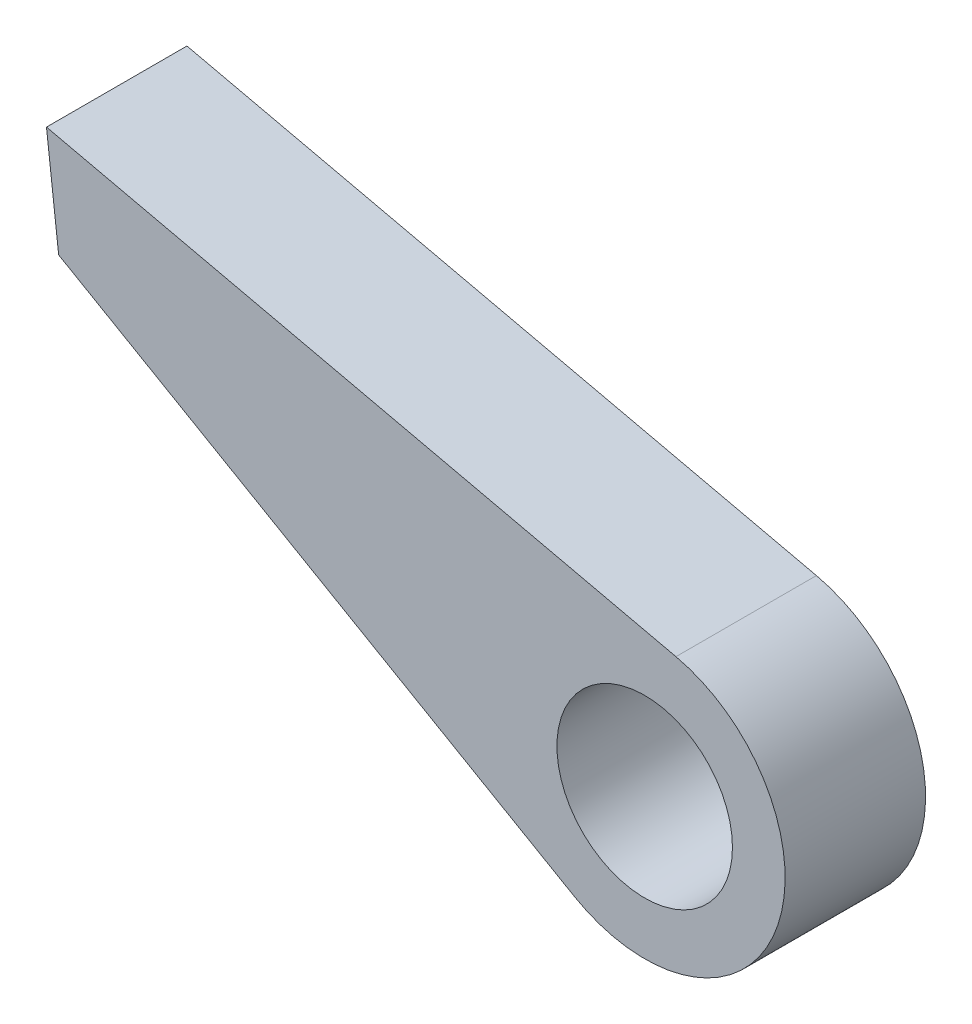
ISO-10303-21;
HEADER;
FILE_DESCRIPTION(('STEP AP214'),'2;1');
FILE_NAME('part.step','',(''),(''),'','','');
FILE_SCHEMA(('AUTOMOTIVE_DESIGN { 1 0 10303 214 1 1 1 1 }'));
ENDSEC;
DATA;
#1=APPLICATION_CONTEXT('core data for automotive mechanical design processes');
#2=APPLICATION_PROTOCOL_DEFINITION('international standard','automotive_design',2000,#1);
#3=PRODUCT_CONTEXT('',#1,'mechanical');
#4=PRODUCT('Part','Part','',(#3));
#5=PRODUCT_RELATED_PRODUCT_CATEGORY('part','',(#4));
#6=PRODUCT_DEFINITION_FORMATION('','',#4);
#7=PRODUCT_DEFINITION_CONTEXT('part definition',#1,'design');
#8=PRODUCT_DEFINITION('design','',#6,#7);
#9=PRODUCT_DEFINITION_SHAPE('','',#8);
#10=(LENGTH_UNIT() NAMED_UNIT(*) SI_UNIT(.MILLI.,.METRE.));
#11=(NAMED_UNIT(*) PLANE_ANGLE_UNIT() SI_UNIT($,.RADIAN.));
#12=(NAMED_UNIT(*) SI_UNIT($,.STERADIAN.) SOLID_ANGLE_UNIT());
#13=UNCERTAINTY_MEASURE_WITH_UNIT(LENGTH_MEASURE(1.E-05),#10,'distance_accuracy_value','');
#14=(GEOMETRIC_REPRESENTATION_CONTEXT(3) GLOBAL_UNCERTAINTY_ASSIGNED_CONTEXT((#13)) GLOBAL_UNIT_ASSIGNED_CONTEXT((#10,
#11,#12)) REPRESENTATION_CONTEXT('',''));
#15=CARTESIAN_POINT('',(0.,0.,0.));
#16=DIRECTION('',(0.,0.,1.));
#17=DIRECTION('',(1.,0.,0.));
#18=AXIS2_PLACEMENT_3D('',#15,#16,#17);
#19=CARTESIAN_POINT('',(0.,0.,2.));
#20=DIRECTION('',(0.,0.,1.));
#21=DIRECTION('',(1.,0.,0.));
#22=AXIS2_PLACEMENT_3D('',#19,#20,#21);
#23=PLANE('',#22);
#24=DIRECTION('',(0.115403848834899,-0.993318655655924,0.));
#25=VECTOR('',#24,1.);
#26=CARTESIAN_POINT('',(-8.34527668816388,2.50874666561476,2.));
#27=LINE('',#26,#25);
#28=CARTESIAN_POINT('',(-8.51838246141623,3.99872464909865,2.));
#29=VERTEX_POINT('',#28);
#30=CARTESIAN_POINT('',(-8.34527668816388,2.50874666561476,2.));
#31=VERTEX_POINT('',#30);
#32=EDGE_CURVE('E85',#29,#31,#27,.T.);
#33=ORIENTED_EDGE('',*,*,#32,.T.);
#34=DIRECTION('',(0.866025403784442,-0.499999999999995,0.));
#35=VECTOR('',#34,1.);
#36=CARTESIAN_POINT('',(-0.999999999999989,-1.73205080756888,2.));
#37=LINE('',#36,#35);
#38=CARTESIAN_POINT('',(-0.999999999999989,-1.73205080756888,2.));
#39=VERTEX_POINT('',#38);
#40=EDGE_CURVE('E80',#31,#39,#37,.T.);
#41=ORIENTED_EDGE('',*,*,#40,.T.);
#42=CARTESIAN_POINT('',(0.,0.,2.));
#43=DIRECTION('',(0.,0.,1.));
#44=DIRECTION('',(1.,0.,0.));
#45=AXIS2_PLACEMENT_3D('',#42,#43,#44);
#46=CIRCLE('',#45,2.);
#47=CARTESIAN_POINT('',(0.445667383964567,1.94971294883893,2.));
#48=VERTEX_POINT('',#47);
#49=EDGE_CURVE('E83',#39,#48,#46,.T.);
#50=ORIENTED_EDGE('',*,*,#49,.T.);
#51=DIRECTION('',(-0.974856474419463,0.222833691982284,0.));
#52=VECTOR('',#51,1.);
#53=CARTESIAN_POINT('',(-8.51838246141623,3.99872464909865,2.));
#54=LINE('',#53,#52);
#55=EDGE_CURVE('E50',#48,#29,#54,.T.);
#56=ORIENTED_EDGE('',*,*,#55,.T.);
#57=EDGE_LOOP('',(#33,#41,#50,#56));
#58=FACE_BOUND('',#57,.T.);
#59=CARTESIAN_POINT('',(0.,0.,2.));
#60=DIRECTION('',(0.,0.,1.));
#61=DIRECTION('',(1.,0.,0.));
#62=AXIS2_PLACEMENT_3D('',#59,#60,#61);
#63=CIRCLE('',#62,1.25);
#64=CARTESIAN_POINT('',(1.25,0.,2.));
#65=VERTEX_POINT('',#64);
#66=EDGE_CURVE('E100',#65,#65,#63,.T.);
#67=ORIENTED_EDGE('',*,*,#66,.F.);
#68=EDGE_LOOP('',(#67));
#69=FACE_BOUND('',#68,.T.);
#70=ADVANCED_FACE('F33',(#58,#69),#23,.T.);
#71=CARTESIAN_POINT('',(0.,0.,0.));
#72=DIRECTION('',(0.,0.,1.));
#73=DIRECTION('',(1.,0.,0.));
#74=AXIS2_PLACEMENT_3D('',#71,#72,#73);
#75=PLANE('',#74);
#76=DIRECTION('',(0.115403848834899,-0.993318655655924,0.));
#77=VECTOR('',#76,1.);
#78=CARTESIAN_POINT('',(-8.34527668816388,2.50874666561476,0.));
#79=LINE('',#78,#77);
#80=CARTESIAN_POINT('',(-8.51838246141623,3.99872464909865,0.));
#81=VERTEX_POINT('',#80);
#82=CARTESIAN_POINT('',(-8.34527668816388,2.50874666561476,0.));
#83=VERTEX_POINT('',#82);
#84=EDGE_CURVE('E97',#81,#83,#79,.T.);
#85=ORIENTED_EDGE('',*,*,#84,.F.);
#86=DIRECTION('',(-0.974856474419463,0.222833691982284,0.));
#87=VECTOR('',#86,1.);
#88=CARTESIAN_POINT('',(-8.51838246141623,3.99872464909865,0.));
#89=LINE('',#88,#87);
#90=CARTESIAN_POINT('',(0.445667383964567,1.94971294883893,0.));
#91=VERTEX_POINT('',#90);
#92=EDGE_CURVE('E73',#91,#81,#89,.T.);
#93=ORIENTED_EDGE('',*,*,#92,.F.);
#94=CARTESIAN_POINT('',(0.,0.,0.));
#95=DIRECTION('',(0.,0.,1.));
#96=DIRECTION('',(1.,0.,0.));
#97=AXIS2_PLACEMENT_3D('',#94,#95,#96);
#98=CIRCLE('',#97,2.);
#99=CARTESIAN_POINT('',(-0.999999999999989,-1.73205080756888,0.));
#100=VERTEX_POINT('',#99);
#101=EDGE_CURVE('E67',#100,#91,#98,.T.);
#102=ORIENTED_EDGE('',*,*,#101,.F.);
#103=DIRECTION('',(0.866025403784442,-0.499999999999995,0.));
#104=VECTOR('',#103,1.);
#105=CARTESIAN_POINT('',(-0.999999999999989,-1.73205080756888,0.));
#106=LINE('',#105,#104);
#107=EDGE_CURVE('E89',#83,#100,#106,.T.);
#108=ORIENTED_EDGE('',*,*,#107,.F.);
#109=EDGE_LOOP('',(#85,#93,#102,#108));
#110=FACE_BOUND('',#109,.T.);
#111=CARTESIAN_POINT('',(0.,0.,0.));
#112=DIRECTION('',(0.,0.,1.));
#113=DIRECTION('',(1.,0.,0.));
#114=AXIS2_PLACEMENT_3D('',#111,#112,#113);
#115=CIRCLE('',#114,1.25);
#116=CARTESIAN_POINT('',(1.25,0.,0.));
#117=VERTEX_POINT('',#116);
#118=EDGE_CURVE('E112',#117,#117,#115,.T.);
#119=ORIENTED_EDGE('',*,*,#118,.T.);
#120=EDGE_LOOP('',(#119));
#121=FACE_BOUND('',#120,.T.);
#122=ADVANCED_FACE('F108',(#110,#121),#75,.F.);
#123=CARTESIAN_POINT('',(-8.34527668816388,2.50874666561476,2.));
#124=DIRECTION('',(0.993318655655924,0.115403848834899,0.));
#125=DIRECTION('',(-0.115403848834899,0.993318655655924,0.));
#126=AXIS2_PLACEMENT_3D('',#123,#124,#125);
#127=PLANE('',#126);
#128=ORIENTED_EDGE('',*,*,#84,.T.);
#129=DIRECTION('',(0.,0.,-1.));
#130=VECTOR('',#129,1.);
#131=CARTESIAN_POINT('',(-8.34527668816388,2.50874666561476,2.));
#132=LINE('',#131,#130);
#133=EDGE_CURVE('E11',#31,#83,#132,.T.);
#134=ORIENTED_EDGE('',*,*,#133,.F.);
#135=ORIENTED_EDGE('',*,*,#32,.F.);
#136=DIRECTION('',(0.,0.,-1.));
#137=VECTOR('',#136,1.);
#138=CARTESIAN_POINT('',(-8.51838246141623,3.99872464909865,2.));
#139=LINE('',#138,#137);
#140=EDGE_CURVE('E93',#29,#81,#139,.T.);
#141=ORIENTED_EDGE('',*,*,#140,.T.);
#142=EDGE_LOOP('',(#128,#134,#135,#141));
#143=FACE_BOUND('',#142,.T.);
#144=ADVANCED_FACE('F35',(#143),#127,.F.);
#145=CARTESIAN_POINT('',(-0.999999999999989,-1.73205080756888,2.));
#146=DIRECTION('',(0.499999999999995,0.866025403784442,0.));
#147=DIRECTION('',(-0.866025403784442,0.499999999999995,0.));
#148=AXIS2_PLACEMENT_3D('',#145,#146,#147);
#149=PLANE('',#148);
#150=ORIENTED_EDGE('',*,*,#107,.T.);
#151=DIRECTION('',(0.,0.,-1.));
#152=VECTOR('',#151,1.);
#153=CARTESIAN_POINT('',(-0.999999999999989,-1.73205080756888,2.));
#154=LINE('',#153,#152);
#155=EDGE_CURVE('E42',#39,#100,#154,.T.);
#156=ORIENTED_EDGE('',*,*,#155,.F.);
#157=ORIENTED_EDGE('',*,*,#40,.F.);
#158=ORIENTED_EDGE('',*,*,#133,.T.);
#159=EDGE_LOOP('',(#150,#156,#157,#158));
#160=FACE_BOUND('',#159,.T.);
#161=ADVANCED_FACE('F88',(#160),#149,.F.);
#162=CARTESIAN_POINT('',(0.,0.,2.));
#163=DIRECTION('',(0.,0.,-1.));
#164=DIRECTION('',(-1.,0.,0.));
#165=AXIS2_PLACEMENT_3D('',#162,#163,#164);
#166=CYLINDRICAL_SURFACE('',#165,2.);
#167=ORIENTED_EDGE('',*,*,#101,.T.);
#168=DIRECTION('',(0.,0.,-1.));
#169=VECTOR('',#168,1.);
#170=CARTESIAN_POINT('',(0.445667383964567,1.94971294883893,2.));
#171=LINE('',#170,#169);
#172=EDGE_CURVE('E90',#48,#91,#171,.T.);
#173=ORIENTED_EDGE('',*,*,#172,.F.);
#174=ORIENTED_EDGE('',*,*,#49,.F.);
#175=ORIENTED_EDGE('',*,*,#155,.T.);
#176=EDGE_LOOP('',(#167,#173,#174,#175));
#177=FACE_BOUND('',#176,.T.);
#178=ADVANCED_FACE('F91',(#177),#166,.T.);
#179=CARTESIAN_POINT('',(-8.51838246141623,3.99872464909865,2.));
#180=DIRECTION('',(-0.222833691982284,-0.974856474419463,0.));
#181=DIRECTION('',(0.974856474419463,-0.222833691982284,0.));
#182=AXIS2_PLACEMENT_3D('',#179,#180,#181);
#183=PLANE('',#182);
#184=ORIENTED_EDGE('',*,*,#92,.T.);
#185=ORIENTED_EDGE('',*,*,#140,.F.);
#186=ORIENTED_EDGE('',*,*,#55,.F.);
#187=ORIENTED_EDGE('',*,*,#172,.T.);
#188=EDGE_LOOP('',(#184,#185,#186,#187));
#189=FACE_BOUND('',#188,.T.);
#190=ADVANCED_FACE('F105',(#189),#183,.F.);
#191=CARTESIAN_POINT('',(0.,0.,2.));
#192=DIRECTION('',(0.,0.,-1.));
#193=DIRECTION('',(-1.,0.,0.));
#194=AXIS2_PLACEMENT_3D('',#191,#192,#193);
#195=CYLINDRICAL_SURFACE('',#194,1.25);
#196=ORIENTED_EDGE('',*,*,#66,.T.);
#197=EDGE_LOOP('',(#196));
#198=FACE_BOUND('',#197,.T.);
#199=ORIENTED_EDGE('',*,*,#118,.F.);
#200=EDGE_LOOP('',(#199));
#201=FACE_BOUND('',#200,.T.);
#202=ADVANCED_FACE('F118',(#198,#201),#195,.F.);
#203=CLOSED_SHELL('',(#70,#122,#144,#161,#178,#190,#202));
#204=MANIFOLD_SOLID_BREP('B2',#203);
#205=ADVANCED_BREP_SHAPE_REPRESENTATION('',(#18,#204),#14);
#206=SHAPE_DEFINITION_REPRESENTATION(#9,#205);
ENDSEC;
END-ISO-10303-21;
